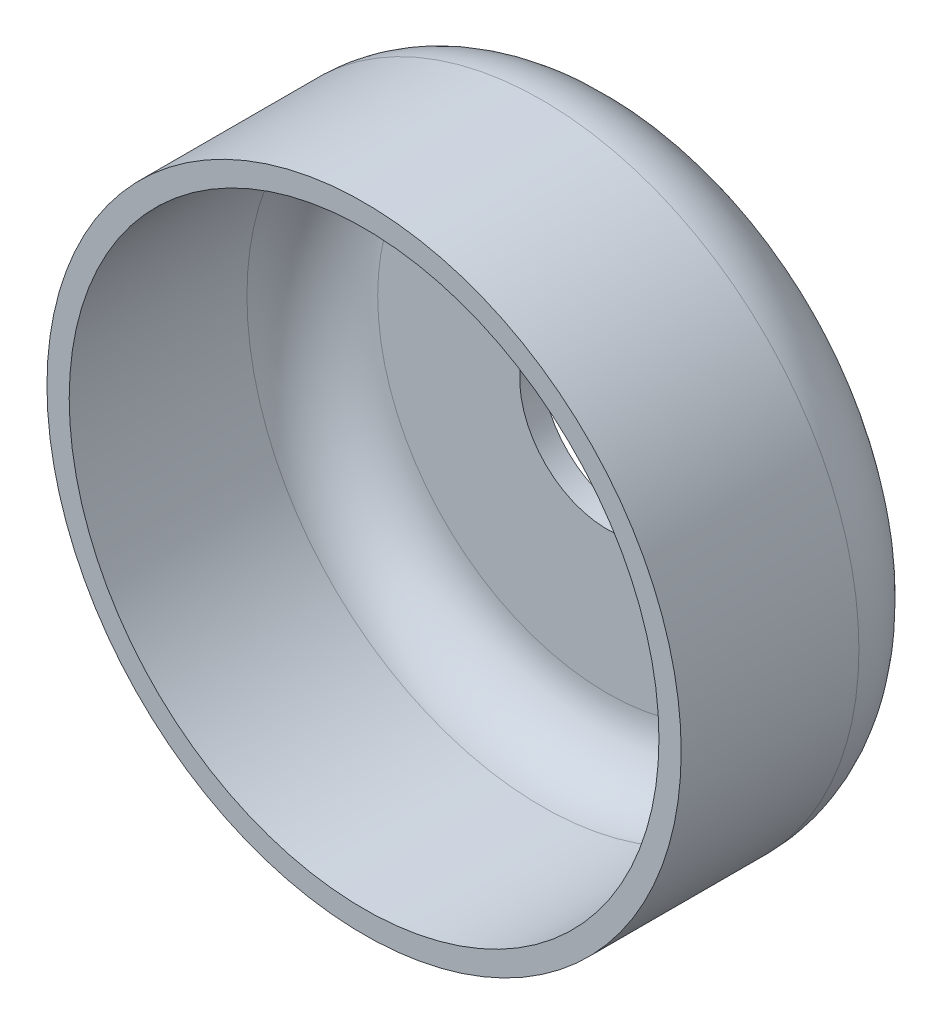
ISO-10303-21;
HEADER;
FILE_DESCRIPTION(('STEP AP214'),'2;1');
FILE_NAME('part.step','',(''),(''),'','','');
FILE_SCHEMA(('AUTOMOTIVE_DESIGN { 1 0 10303 214 1 1 1 1 }'));
ENDSEC;
DATA;
#1=APPLICATION_CONTEXT('core data for automotive mechanical design processes');
#2=APPLICATION_PROTOCOL_DEFINITION('international standard','automotive_design',2000,#1);
#3=PRODUCT_CONTEXT('',#1,'mechanical');
#4=PRODUCT('Part','Part','',(#3));
#5=PRODUCT_RELATED_PRODUCT_CATEGORY('part','',(#4));
#6=PRODUCT_DEFINITION_FORMATION('','',#4);
#7=PRODUCT_DEFINITION_CONTEXT('part definition',#1,'design');
#8=PRODUCT_DEFINITION('design','',#6,#7);
#9=PRODUCT_DEFINITION_SHAPE('','',#8);
#10=(LENGTH_UNIT() NAMED_UNIT(*) SI_UNIT(.MILLI.,.METRE.));
#11=(NAMED_UNIT(*) PLANE_ANGLE_UNIT() SI_UNIT($,.RADIAN.));
#12=(NAMED_UNIT(*) SI_UNIT($,.STERADIAN.) SOLID_ANGLE_UNIT());
#13=UNCERTAINTY_MEASURE_WITH_UNIT(LENGTH_MEASURE(1.E-05),#10,'distance_accuracy_value','');
#14=(GEOMETRIC_REPRESENTATION_CONTEXT(3) GLOBAL_UNCERTAINTY_ASSIGNED_CONTEXT((#13)) GLOBAL_UNIT_ASSIGNED_CONTEXT((#10,
#11,#12)) REPRESENTATION_CONTEXT('',''));
#15=CARTESIAN_POINT('',(0.,0.,0.));
#16=DIRECTION('',(0.,0.,1.));
#17=DIRECTION('',(1.,0.,0.));
#18=AXIS2_PLACEMENT_3D('',#15,#16,#17);
#19=CARTESIAN_POINT('',(0.,8.64869999999999,-10.3378));
#20=DIRECTION('',(0.,0.,-1.));
#21=DIRECTION('',(-1.,0.,0.));
#22=AXIS2_PLACEMENT_3D('',#19,#20,#21);
#23=PLANE('',#22);
#24=CARTESIAN_POINT('',(0.,0.,-10.3378));
#25=DIRECTION('',(0.,0.,1.));
#26=DIRECTION('',(1.,0.,0.));
#27=AXIS2_PLACEMENT_3D('',#24,#25,#26);
#28=CIRCLE('',#27,3.3);
#29=CARTESIAN_POINT('',(3.3,0.,-10.3378));
#30=VERTEX_POINT('',#29);
#31=EDGE_CURVE('E57',#30,#30,#28,.T.);
#32=ORIENTED_EDGE('',*,*,#31,.F.);
#33=EDGE_LOOP('',(#32));
#34=FACE_BOUND('',#33,.T.);
#35=CARTESIAN_POINT('',(0.,0.,-10.3378));
#36=DIRECTION('',(0.,0.,1.));
#37=DIRECTION('',(1.,0.,0.));
#38=AXIS2_PLACEMENT_3D('',#35,#36,#37);
#39=CIRCLE('',#38,8.64869999999999);
#40=CARTESIAN_POINT('',(8.64869999999999,0.,-10.3378));
#41=VERTEX_POINT('',#40);
#42=EDGE_CURVE('E37',#41,#41,#39,.T.);
#43=ORIENTED_EDGE('',*,*,#42,.T.);
#44=EDGE_LOOP('',(#43));
#45=FACE_BOUND('',#44,.T.);
#46=ADVANCED_FACE('F30',(#34,#45),#23,.F.);
#47=CARTESIAN_POINT('',(0.,0.,-7.874));
#48=DIRECTION('',(0.,0.,1.));
#49=DIRECTION('',(1.,0.,0.));
#50=AXIS2_PLACEMENT_3D('',#47,#48,#49);
#51=TOROIDAL_SURFACE('',#50,8.64869999999999,2.46380000000001);
#52=ORIENTED_EDGE('',*,*,#42,.F.);
#53=EDGE_LOOP('',(#52));
#54=FACE_BOUND('',#53,.T.);
#55=CARTESIAN_POINT('',(0.,0.,-7.874));
#56=DIRECTION('',(0.,0.,1.));
#57=DIRECTION('',(1.,0.,0.));
#58=AXIS2_PLACEMENT_3D('',#55,#56,#57);
#59=CIRCLE('',#58,11.1125);
#60=CARTESIAN_POINT('',(11.1125,0.,-7.874));
#61=VERTEX_POINT('',#60);
#62=EDGE_CURVE('E41',#61,#61,#59,.T.);
#63=ORIENTED_EDGE('',*,*,#62,.T.);
#64=EDGE_LOOP('',(#63));
#65=FACE_BOUND('',#64,.T.);
#66=ADVANCED_FACE('F73',(#54,#65),#51,.F.);
#67=CARTESIAN_POINT('',(0.,0.,11.176));
#68=DIRECTION('',(0.,0.,1.));
#69=DIRECTION('',(1.,0.,0.));
#70=AXIS2_PLACEMENT_3D('',#67,#68,#69);
#71=CYLINDRICAL_SURFACE('',#70,11.1125);
#72=CARTESIAN_POINT('',(0.,0.,-1.17600000000001));
#73=DIRECTION('',(0.,0.,-1.));
#74=DIRECTION('',(-1.,0.,0.));
#75=AXIS2_PLACEMENT_3D('',#72,#73,#74);
#76=CIRCLE('',#75,11.1125);
#77=CARTESIAN_POINT('',(-11.1125,0.,-1.17600000000001));
#78=VERTEX_POINT('',#77);
#79=EDGE_CURVE('E53',#78,#78,#76,.F.);
#80=ORIENTED_EDGE('',*,*,#79,.T.);
#81=EDGE_LOOP('',(#80));
#82=FACE_BOUND('',#81,.T.);
#83=ORIENTED_EDGE('',*,*,#62,.F.);
#84=EDGE_LOOP('',(#83));
#85=FACE_BOUND('',#84,.T.);
#86=ADVANCED_FACE('F77',(#82,#85),#71,.F.);
#87=CARTESIAN_POINT('',(-11.9507,-11.9507,-1.17600000000001));
#88=DIRECTION('',(0.,0.,-1.));
#89=DIRECTION('',(-1.,0.,0.));
#90=AXIS2_PLACEMENT_3D('',#87,#88,#89);
#91=PLANE('',#90);
#92=CARTESIAN_POINT('',(0.,0.,-1.17600000000001));
#93=DIRECTION('',(0.,0.,-1.));
#94=DIRECTION('',(-1.,0.,0.));
#95=AXIS2_PLACEMENT_3D('',#92,#93,#94);
#96=CIRCLE('',#95,11.9507);
#97=CARTESIAN_POINT('',(-11.9507,0.,-1.17600000000001));
#98=VERTEX_POINT('',#97);
#99=EDGE_CURVE('E10',#98,#98,#96,.T.);
#100=ORIENTED_EDGE('',*,*,#99,.F.);
#101=EDGE_LOOP('',(#100));
#102=FACE_BOUND('',#101,.T.);
#103=ORIENTED_EDGE('',*,*,#79,.F.);
#104=EDGE_LOOP('',(#103));
#105=FACE_BOUND('',#104,.T.);
#106=ADVANCED_FACE('F83',(#102,#105),#91,.F.);
#107=CARTESIAN_POINT('',(0.,8.64869999999999,-11.176));
#108=DIRECTION('',(0.,0.,1.));
#109=DIRECTION('',(1.,0.,0.));
#110=AXIS2_PLACEMENT_3D('',#107,#108,#109);
#111=PLANE('',#110);
#112=CARTESIAN_POINT('',(0.,0.,-11.176));
#113=DIRECTION('',(0.,0.,1.));
#114=DIRECTION('',(1.,0.,0.));
#115=AXIS2_PLACEMENT_3D('',#112,#113,#114);
#116=CIRCLE('',#115,3.3);
#117=CARTESIAN_POINT('',(3.3,0.,-11.176));
#118=VERTEX_POINT('',#117);
#119=EDGE_CURVE('E56',#118,#118,#116,.T.);
#120=ORIENTED_EDGE('',*,*,#119,.T.);
#121=EDGE_LOOP('',(#120));
#122=FACE_BOUND('',#121,.T.);
#123=CARTESIAN_POINT('',(0.,0.,-11.176));
#124=DIRECTION('',(0.,0.,1.));
#125=DIRECTION('',(1.,0.,0.));
#126=AXIS2_PLACEMENT_3D('',#123,#124,#125);
#127=CIRCLE('',#126,8.64869999999999);
#128=CARTESIAN_POINT('',(8.64869999999999,0.,-11.176));
#129=VERTEX_POINT('',#128);
#130=EDGE_CURVE('E50',#129,#129,#127,.T.);
#131=ORIENTED_EDGE('',*,*,#130,.F.);
#132=EDGE_LOOP('',(#131));
#133=FACE_BOUND('',#132,.T.);
#134=ADVANCED_FACE('F32',(#122,#133),#111,.F.);
#135=CARTESIAN_POINT('',(0.,0.,-7.874));
#136=DIRECTION('',(0.,0.,1.));
#137=DIRECTION('',(1.,0.,0.));
#138=AXIS2_PLACEMENT_3D('',#135,#136,#137);
#139=TOROIDAL_SURFACE('',#138,8.64869999999999,3.302);
#140=CARTESIAN_POINT('',(0.,0.,-7.874));
#141=DIRECTION('',(0.,0.,1.));
#142=DIRECTION('',(1.,0.,0.));
#143=AXIS2_PLACEMENT_3D('',#140,#141,#142);
#144=CIRCLE('',#143,11.9507);
#145=CARTESIAN_POINT('',(11.9507,0.,-7.874));
#146=VERTEX_POINT('',#145);
#147=EDGE_CURVE('E45',#146,#146,#144,.T.);
#148=ORIENTED_EDGE('',*,*,#147,.F.);
#149=EDGE_LOOP('',(#148));
#150=FACE_BOUND('',#149,.T.);
#151=ORIENTED_EDGE('',*,*,#130,.T.);
#152=EDGE_LOOP('',(#151));
#153=FACE_BOUND('',#152,.T.);
#154=ADVANCED_FACE('F87',(#150,#153),#139,.T.);
#155=CARTESIAN_POINT('',(0.,0.,11.176));
#156=DIRECTION('',(0.,0.,1.));
#157=DIRECTION('',(1.,0.,0.));
#158=AXIS2_PLACEMENT_3D('',#155,#156,#157);
#159=CYLINDRICAL_SURFACE('',#158,11.9507);
#160=ORIENTED_EDGE('',*,*,#99,.T.);
#161=EDGE_LOOP('',(#160));
#162=FACE_BOUND('',#161,.T.);
#163=ORIENTED_EDGE('',*,*,#147,.T.);
#164=EDGE_LOOP('',(#163));
#165=FACE_BOUND('',#164,.T.);
#166=ADVANCED_FACE('F68',(#162,#165),#159,.T.);
#167=CARTESIAN_POINT('',(0.,0.,-11.176));
#168=DIRECTION('',(0.,0.,1.));
#169=DIRECTION('',(1.,0.,0.));
#170=AXIS2_PLACEMENT_3D('',#167,#168,#169);
#171=CYLINDRICAL_SURFACE('',#170,3.3);
#172=ORIENTED_EDGE('',*,*,#119,.F.);
#173=EDGE_LOOP('',(#172));
#174=FACE_BOUND('',#173,.T.);
#175=ORIENTED_EDGE('',*,*,#31,.T.);
#176=EDGE_LOOP('',(#175));
#177=FACE_BOUND('',#176,.T.);
#178=ADVANCED_FACE('F65',(#174,#177),#171,.F.);
#179=CLOSED_SHELL('',(#46,#66,#86,#106,#134,#154,#166,#178));
#180=MANIFOLD_SOLID_BREP('B2',#179);
#181=ADVANCED_BREP_SHAPE_REPRESENTATION('',(#18,#180),#14);
#182=SHAPE_DEFINITION_REPRESENTATION(#9,#181);
ENDSEC;
END-ISO-10303-21;
